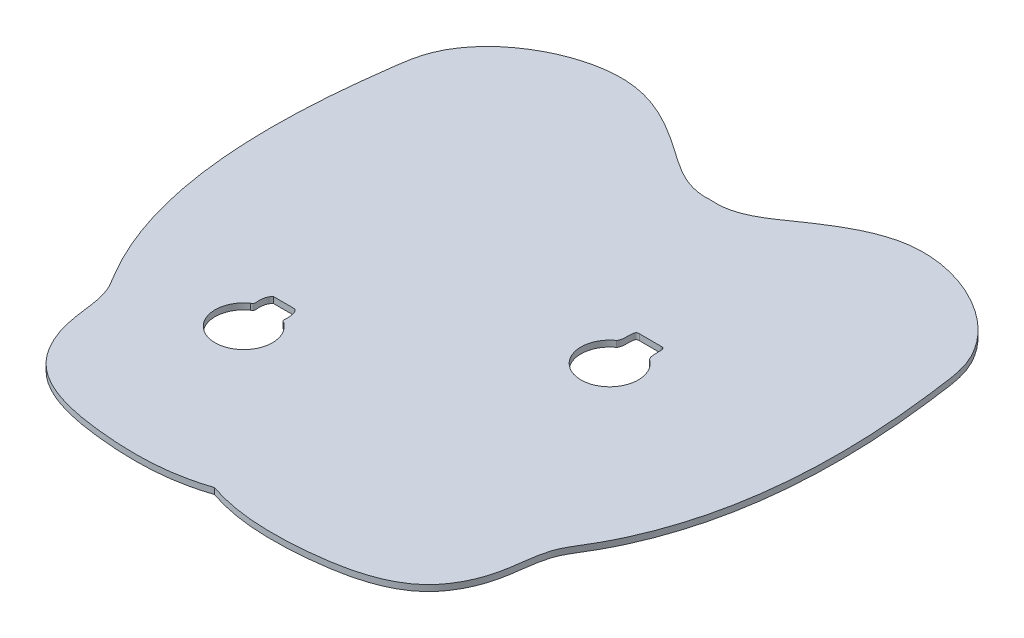
ISO-10303-21;
HEADER;
FILE_DESCRIPTION(('STEP AP214'),'2;1');
FILE_NAME('part.step','',(''),(''),'','','');
FILE_SCHEMA(('AUTOMOTIVE_DESIGN { 1 0 10303 214 1 1 1 1 }'));
ENDSEC;
DATA;
#1=APPLICATION_CONTEXT('core data for automotive mechanical design processes');
#2=APPLICATION_PROTOCOL_DEFINITION('international standard','automotive_design',2000,#1);
#3=PRODUCT_CONTEXT('',#1,'mechanical');
#4=PRODUCT('Part','Part','',(#3));
#5=PRODUCT_RELATED_PRODUCT_CATEGORY('part','',(#4));
#6=PRODUCT_DEFINITION_FORMATION('','',#4);
#7=PRODUCT_DEFINITION_CONTEXT('part definition',#1,'design');
#8=PRODUCT_DEFINITION('design','',#6,#7);
#9=PRODUCT_DEFINITION_SHAPE('','',#8);
#10=(LENGTH_UNIT() NAMED_UNIT(*) SI_UNIT(.MILLI.,.METRE.));
#11=(NAMED_UNIT(*) PLANE_ANGLE_UNIT() SI_UNIT($,.RADIAN.));
#12=(NAMED_UNIT(*) SI_UNIT($,.STERADIAN.) SOLID_ANGLE_UNIT());
#13=UNCERTAINTY_MEASURE_WITH_UNIT(LENGTH_MEASURE(1.E-05),#10,'distance_accuracy_value','');
#14=(GEOMETRIC_REPRESENTATION_CONTEXT(3) GLOBAL_UNCERTAINTY_ASSIGNED_CONTEXT((#13)) GLOBAL_UNIT_ASSIGNED_CONTEXT((#10,
#11,#12)) REPRESENTATION_CONTEXT('',''));
#15=CARTESIAN_POINT('',(0.,0.,0.));
#16=DIRECTION('',(0.,0.,1.));
#17=DIRECTION('',(1.,0.,0.));
#18=AXIS2_PLACEMENT_3D('',#15,#16,#17);
#19=CARTESIAN_POINT('',(-20.8375800086224,2.54,102.170002649145));
#20=DIRECTION('',(0.,1.,0.));
#21=DIRECTION('',(0.,0.,1.));
#22=AXIS2_PLACEMENT_3D('',#19,#20,#21);
#23=PLANE('',#22);
#24=CARTESIAN_POINT('',(97.1721351241759,2.54,18.4153912724598));
#25=CARTESIAN_POINT('',(86.9381358847611,2.54,19.2869067275485));
#26=CARTESIAN_POINT('',(69.4619432479532,2.54,6.07035229588758));
#27=CARTESIAN_POINT('',(31.9557121332239,2.54,-17.2698050691913));
#28=CARTESIAN_POINT('',(-14.2382537415554,2.54,8.22535922004084));
#29=CARTESIAN_POINT('',(-18.010342377572,2.54,36.8793977022031));
#30=CARTESIAN_POINT('',(-24.208672036037,2.54,85.5185639436605));
#31=CARTESIAN_POINT('',(-22.2420602699873,2.54,137.434896367088));
#32=CARTESIAN_POINT('',(5.397241741159,2.54,180.268479021682));
#33=CARTESIAN_POINT('',(5.18009338432536,2.54,197.344803998025));
#34=CARTESIAN_POINT('',(17.409892045632,2.54,224.155676750959));
#35=CARTESIAN_POINT('',(55.745285735242,2.54,232.253076746622));
#36=CARTESIAN_POINT('',(83.3591606785834,2.54,231.368122156612));
#37=CARTESIAN_POINT('',(97.172135124176,2.54,226.672036014327));
#38=B_SPLINE_CURVE_WITH_KNOTS('',3,(#24,#25,#26,#27,#28,#29,#30,#31,#32,#33,#34,#35,#36,#37),
.UNSPECIFIED.,.F.,.F.,(4,1,1,1,1,1,1,1,1,1,1,4),(0.,0.0687687026944584,0.1602583903557,
0.311610255857059,0.34503435388355,0.37053540951732,0.674249376379556,0.690214481787574,
0.741590817935685,0.795466328784328,0.892793029162693,1.),.UNSPECIFIED.);
#39=CARTESIAN_POINT('',(97.1721351241759,2.54,18.4153912724598));
#40=VERTEX_POINT('',#39);
#41=CARTESIAN_POINT('',(97.1721351241759,2.54,226.672036014327));
#42=VERTEX_POINT('',#41);
#43=EDGE_CURVE('E215',#40,#42,#38,.T.);
#44=ORIENTED_EDGE('',*,*,#43,.T.);
#45=CARTESIAN_POINT('',(97.1721351241759,2.54,226.672036014327));
#46=CARTESIAN_POINT('',(110.985109569769,2.54,231.368122156611));
#47=CARTESIAN_POINT('',(138.59898451311,2.54,232.253076746622));
#48=CARTESIAN_POINT('',(176.93437820272,2.54,224.155676750959));
#49=CARTESIAN_POINT('',(189.164176864027,2.54,197.344803998025));
#50=CARTESIAN_POINT('',(188.947028507193,2.54,180.268479021682));
#51=CARTESIAN_POINT('',(216.586330518339,2.54,137.434896367088));
#52=CARTESIAN_POINT('',(218.552942284389,2.54,85.5185639436604));
#53=CARTESIAN_POINT('',(212.354612625924,2.54,36.8793977022031));
#54=CARTESIAN_POINT('',(208.582523989907,2.54,8.22535922004083));
#55=CARTESIAN_POINT('',(162.388558115128,2.54,-17.2698050691913));
#56=CARTESIAN_POINT('',(124.882327000399,2.54,6.07035229588758));
#57=CARTESIAN_POINT('',(107.406134363591,2.54,19.2869067275485));
#58=CARTESIAN_POINT('',(97.1721351241759,2.54,18.4153912724598));
#59=B_SPLINE_CURVE_WITH_KNOTS('',3,(#45,#46,#47,#48,#49,#50,#51,#52,#53,#54,#55,#56,#57,#58),
.UNSPECIFIED.,.F.,.F.,(4,1,1,1,1,1,1,1,1,1,1,4),(0.,0.107206970837307,0.204533671215672,
0.258409182064315,0.309785518212426,0.325750623620444,0.62946459048268,0.65496564611645,
0.688389744142941,0.8397416096443,0.931231297305542,1.),.UNSPECIFIED.);
#60=EDGE_CURVE('E221',#42,#40,#59,.T.);
#61=ORIENTED_EDGE('',*,*,#60,.T.);
#62=EDGE_LOOP('',(#44,#61));
#63=FACE_BOUND('',#62,.T.);
#64=CARTESIAN_POINT('',(44.8677574796913,2.54,162.018397049279));
#65=DIRECTION('',(0.,1.,0.));
#66=DIRECTION('',(0.,0.,1.));
#67=AXIS2_PLACEMENT_3D('',#64,#65,#66);
#68=CIRCLE('',#67,11.9999999999999);
#69=CARTESIAN_POINT('',(37.8824598710261,2.54,152.261060459903));
#70=VERTEX_POINT('',#69);
#71=CARTESIAN_POINT('',(51.8530550883565,2.54,152.261060459903));
#72=VERTEX_POINT('',#71);
#73=EDGE_CURVE('E176',#70,#72,#68,.T.);
#74=ORIENTED_EDGE('',*,*,#73,.F.);
#75=CARTESIAN_POINT('',(40.3401142737763,2.54,145.018397049279));
#76=CARTESIAN_POINT('',(39.3814406831947,2.54,145.772707702371));
#77=CARTESIAN_POINT('',(38.7671652824351,2.54,147.6979702965));
#78=CARTESIAN_POINT('',(38.6502501914807,2.54,150.268136991017));
#79=CARTESIAN_POINT('',(39.0151163970304,2.54,152.139704427047));
#80=CARTESIAN_POINT('',(37.8824598710261,2.54,152.261060459903));
#81=B_SPLINE_CURVE_WITH_KNOTS('',3,(#75,#76,#77,#78,#79,#80),.UNSPECIFIED.,.F.,.F.,(4,1,1,4),
(0.,0.42459825654506,0.700852789682517,1.),.UNSPECIFIED.);
#82=CARTESIAN_POINT('',(40.3401142737763,2.54,145.018397049279));
#83=VERTEX_POINT('',#82);
#84=EDGE_CURVE('E204',#83,#70,#81,.T.);
#85=ORIENTED_EDGE('',*,*,#84,.F.);
#86=DIRECTION('',(-1.,0.,0.));
#87=VECTOR('',#86,1.);
#88=CARTESIAN_POINT('',(49.3954006856062,2.54,145.018397049279));
#89=LINE('',#88,#87);
#90=CARTESIAN_POINT('',(49.3954006856062,2.54,145.018397049279));
#91=VERTEX_POINT('',#90);
#92=EDGE_CURVE('E175',#91,#83,#89,.T.);
#93=ORIENTED_EDGE('',*,*,#92,.F.);
#94=CARTESIAN_POINT('',(51.8530550883565,2.54,152.261060459903));
#95=CARTESIAN_POINT('',(50.7203985623522,2.54,152.139704427047));
#96=CARTESIAN_POINT('',(51.0852647679019,2.54,150.268136991017));
#97=CARTESIAN_POINT('',(50.9683496769475,2.54,147.6979702965));
#98=CARTESIAN_POINT('',(50.3540742761878,2.54,145.772707702371));
#99=CARTESIAN_POINT('',(49.3954006856062,2.54,145.018397049279));
#100=B_SPLINE_CURVE_WITH_KNOTS('',3,(#94,#95,#96,#97,#98,#99),.UNSPECIFIED.,.F.,.F.,(4,1,1,4),
(0.,0.299147210317482,0.575401743454939,1.),.UNSPECIFIED.);
#101=EDGE_CURVE('E168',#72,#91,#100,.T.);
#102=ORIENTED_EDGE('',*,*,#101,.F.);
#103=EDGE_LOOP('',(#74,#85,#93,#102));
#104=FACE_BOUND('',#103,.T.);
#105=CARTESIAN_POINT('',(134.999228380033,2.54,98.8681613024392));
#106=DIRECTION('',(0.,1.,0.));
#107=DIRECTION('',(0.,0.,1.));
#108=AXIS2_PLACEMENT_3D('',#105,#106,#107);
#109=CIRCLE('',#108,11.9999999999999);
#110=CARTESIAN_POINT('',(128.013930771368,2.54,89.1108247130634));
#111=VERTEX_POINT('',#110);
#112=CARTESIAN_POINT('',(141.984525988698,2.54,89.1108247130634));
#113=VERTEX_POINT('',#112);
#114=EDGE_CURVE('E119',#111,#113,#109,.T.);
#115=ORIENTED_EDGE('',*,*,#114,.F.);
#116=CARTESIAN_POINT('',(130.471585174118,2.54,81.8681613024392));
#117=CARTESIAN_POINT('',(129.192079186311,2.54,81.7060575223993));
#118=CARTESIAN_POINT('',(128.906248150761,2.54,83.5117356710188));
#119=CARTESIAN_POINT('',(128.877525774979,2.54,86.1686643913991));
#120=CARTESIAN_POINT('',(128.871790734044,2.54,88.1620080617034));
#121=CARTESIAN_POINT('',(128.013930771368,2.54,89.1108247130634));
#122=B_SPLINE_CURVE_WITH_KNOTS('',3,(#116,#117,#118,#119,#120,#121),.UNSPECIFIED.,.F.,.F.,(4,1,
1,4),(0.,0.308328890007901,0.579015788955856,1.),.UNSPECIFIED.);
#123=CARTESIAN_POINT('',(130.471585174118,2.54,81.8681613024392));
#124=VERTEX_POINT('',#123);
#125=EDGE_CURVE('E111',#124,#111,#122,.T.);
#126=ORIENTED_EDGE('',*,*,#125,.F.);
#127=DIRECTION('',(-1.,0.,0.));
#128=VECTOR('',#127,1.);
#129=CARTESIAN_POINT('',(139.526871585948,2.54,81.8681613024392));
#130=LINE('',#129,#128);
#131=CARTESIAN_POINT('',(139.526871585948,2.54,81.8681613024392));
#132=VERTEX_POINT('',#131);
#133=EDGE_CURVE('E133',#132,#124,#130,.T.);
#134=ORIENTED_EDGE('',*,*,#133,.F.);
#135=CARTESIAN_POINT('',(141.984525988698,2.54,89.1108247130634));
#136=CARTESIAN_POINT('',(141.126666026022,2.54,88.1620080617035));
#137=CARTESIAN_POINT('',(141.120930985087,2.54,86.1686643913991));
#138=CARTESIAN_POINT('',(141.092208609305,2.54,83.5117356710188));
#139=CARTESIAN_POINT('',(140.806377573755,2.54,81.7060575223993));
#140=CARTESIAN_POINT('',(139.526871585948,2.54,81.8681613024392));
#141=B_SPLINE_CURVE_WITH_KNOTS('',3,(#135,#136,#137,#138,#139,#140),.UNSPECIFIED.,.F.,.F.,(4,1,
1,4),(0.,0.420984211044144,0.691671109992099,1.),.UNSPECIFIED.);
#142=EDGE_CURVE('E131',#113,#132,#141,.T.);
#143=ORIENTED_EDGE('',*,*,#142,.F.);
#144=EDGE_LOOP('',(#115,#126,#134,#143));
#145=FACE_BOUND('',#144,.T.);
#146=ADVANCED_FACE('F33',(#63,#104,#145),#23,.T.);
#147=CARTESIAN_POINT('',(-20.8375800086224,0.,102.170002649145));
#148=DIRECTION('',(0.,1.,0.));
#149=DIRECTION('',(0.,0.,1.));
#150=AXIS2_PLACEMENT_3D('',#147,#148,#149);
#151=PLANE('',#150);
#152=CARTESIAN_POINT('',(40.3401142737763,0.,145.018397049279));
#153=CARTESIAN_POINT('',(39.3814406831947,0.,145.772707702371));
#154=CARTESIAN_POINT('',(38.7671652824351,0.,147.6979702965));
#155=CARTESIAN_POINT('',(38.6502501914807,0.,150.268136991017));
#156=CARTESIAN_POINT('',(39.0151163970304,0.,152.139704427047));
#157=CARTESIAN_POINT('',(37.8824598710261,0.,152.261060459903));
#158=B_SPLINE_CURVE_WITH_KNOTS('',3,(#152,#153,#154,#155,#156,#157),.UNSPECIFIED.,.F.,.F.,(4,1,
1,4),(0.,0.42459825654506,0.700852789682517,1.),.UNSPECIFIED.);
#159=CARTESIAN_POINT('',(40.3401142737763,0.,145.018397049279));
#160=VERTEX_POINT('',#159);
#161=CARTESIAN_POINT('',(37.8824598710261,0.,152.261060459903));
#162=VERTEX_POINT('',#161);
#163=EDGE_CURVE('E127',#160,#162,#158,.T.);
#164=ORIENTED_EDGE('',*,*,#163,.T.);
#165=CARTESIAN_POINT('',(44.8677574796913,0.,162.018397049279));
#166=DIRECTION('',(0.,1.,0.));
#167=DIRECTION('',(0.,0.,1.));
#168=AXIS2_PLACEMENT_3D('',#165,#166,#167);
#169=CIRCLE('',#168,11.9999999999999);
#170=CARTESIAN_POINT('',(51.8530550883565,0.,152.261060459903));
#171=VERTEX_POINT('',#170);
#172=EDGE_CURVE('E187',#162,#171,#169,.T.);
#173=ORIENTED_EDGE('',*,*,#172,.T.);
#174=CARTESIAN_POINT('',(51.8530550883565,0.,152.261060459903));
#175=CARTESIAN_POINT('',(50.7203985623522,0.,152.139704427047));
#176=CARTESIAN_POINT('',(51.0852647679019,0.,150.268136991017));
#177=CARTESIAN_POINT('',(50.9683496769475,0.,147.6979702965));
#178=CARTESIAN_POINT('',(50.3540742761878,0.,145.772707702371));
#179=CARTESIAN_POINT('',(49.3954006856062,0.,145.018397049279));
#180=B_SPLINE_CURVE_WITH_KNOTS('',3,(#174,#175,#176,#177,#178,#179),.UNSPECIFIED.,.F.,.F.,(4,1,
1,4),(0.,0.299147210317482,0.575401743454939,1.),.UNSPECIFIED.);
#181=CARTESIAN_POINT('',(49.3954006856062,0.,145.018397049279));
#182=VERTEX_POINT('',#181);
#183=EDGE_CURVE('E193',#171,#182,#180,.T.);
#184=ORIENTED_EDGE('',*,*,#183,.T.);
#185=DIRECTION('',(-1.,0.,0.));
#186=VECTOR('',#185,1.);
#187=CARTESIAN_POINT('',(40.3401142737763,0.,145.018397049279));
#188=LINE('',#187,#186);
#189=EDGE_CURVE('E198',#182,#160,#188,.T.);
#190=ORIENTED_EDGE('',*,*,#189,.T.);
#191=EDGE_LOOP('',(#164,#173,#184,#190));
#192=FACE_BOUND('',#191,.T.);
#193=CARTESIAN_POINT('',(97.1721351241759,0.,18.4153912724598));
#194=CARTESIAN_POINT('',(86.9381358847611,0.,19.2869067275485));
#195=CARTESIAN_POINT('',(69.4619432479532,0.,6.07035229588758));
#196=CARTESIAN_POINT('',(31.9557121332239,0.,-17.2698050691913));
#197=CARTESIAN_POINT('',(-14.2382537415554,0.,8.22535922004084));
#198=CARTESIAN_POINT('',(-18.010342377572,0.,36.8793977022031));
#199=CARTESIAN_POINT('',(-24.208672036037,0.,85.5185639436605));
#200=CARTESIAN_POINT('',(-22.2420602699873,0.,137.434896367088));
#201=CARTESIAN_POINT('',(5.397241741159,0.,180.268479021682));
#202=CARTESIAN_POINT('',(5.18009338432536,0.,197.344803998025));
#203=CARTESIAN_POINT('',(17.409892045632,0.,224.155676750959));
#204=CARTESIAN_POINT('',(55.745285735242,0.,232.253076746622));
#205=CARTESIAN_POINT('',(83.3591606785834,0.,231.368122156612));
#206=CARTESIAN_POINT('',(97.172135124176,0.,226.672036014327));
#207=B_SPLINE_CURVE_WITH_KNOTS('',3,(#193,#194,#195,#196,#197,#198,#199,#200,#201,#202,#203,
#204,#205,#206),.UNSPECIFIED.,.F.,.F.,(4,1,1,1,1,1,1,1,1,1,1,4),(0.,0.0687687026944584,
0.1602583903557,0.311610255857059,0.34503435388355,0.37053540951732,0.674249376379556,
0.690214481787574,0.741590817935685,0.795466328784328,0.892793029162693,1.),.UNSPECIFIED.);
#208=CARTESIAN_POINT('',(97.1721351241759,0.,18.4153912724598));
#209=VERTEX_POINT('',#208);
#210=CARTESIAN_POINT('',(97.1721351241759,0.,226.672036014327));
#211=VERTEX_POINT('',#210);
#212=EDGE_CURVE('E214',#209,#211,#207,.T.);
#213=ORIENTED_EDGE('',*,*,#212,.F.);
#214=CARTESIAN_POINT('',(97.1721351241759,0.,226.672036014327));
#215=CARTESIAN_POINT('',(110.985109569769,0.,231.368122156611));
#216=CARTESIAN_POINT('',(138.59898451311,0.,232.253076746622));
#217=CARTESIAN_POINT('',(176.93437820272,0.,224.155676750959));
#218=CARTESIAN_POINT('',(189.164176864027,0.,197.344803998025));
#219=CARTESIAN_POINT('',(188.947028507193,0.,180.268479021682));
#220=CARTESIAN_POINT('',(216.586330518339,0.,137.434896367088));
#221=CARTESIAN_POINT('',(218.552942284389,0.,85.5185639436604));
#222=CARTESIAN_POINT('',(212.354612625924,0.,36.8793977022031));
#223=CARTESIAN_POINT('',(208.582523989907,0.,8.22535922004083));
#224=CARTESIAN_POINT('',(162.388558115128,0.,-17.2698050691913));
#225=CARTESIAN_POINT('',(124.882327000399,0.,6.07035229588758));
#226=CARTESIAN_POINT('',(107.406134363591,0.,19.2869067275485));
#227=CARTESIAN_POINT('',(97.1721351241759,0.,18.4153912724598));
#228=B_SPLINE_CURVE_WITH_KNOTS('',3,(#214,#215,#216,#217,#218,#219,#220,#221,#222,#223,#224,
#225,#226,#227),.UNSPECIFIED.,.F.,.F.,(4,1,1,1,1,1,1,1,1,1,1,4),(0.,0.107206970837307,
0.204533671215672,0.258409182064315,0.309785518212426,0.325750623620444,0.62946459048268,
0.65496564611645,0.688389744142941,0.8397416096443,0.931231297305542,1.),.UNSPECIFIED.);
#229=EDGE_CURVE('E222',#211,#209,#228,.T.);
#230=ORIENTED_EDGE('',*,*,#229,.F.);
#231=EDGE_LOOP('',(#213,#230));
#232=FACE_BOUND('',#231,.T.);
#233=CARTESIAN_POINT('',(130.471585174118,0.,81.8681613024392));
#234=CARTESIAN_POINT('',(129.192079186311,0.,81.7060575223993));
#235=CARTESIAN_POINT('',(128.906248150761,0.,83.5117356710188));
#236=CARTESIAN_POINT('',(128.877525774979,0.,86.1686643913991));
#237=CARTESIAN_POINT('',(128.871790734044,0.,88.1620080617034));
#238=CARTESIAN_POINT('',(128.013930771368,0.,89.1108247130634));
#239=B_SPLINE_CURVE_WITH_KNOTS('',3,(#233,#234,#235,#236,#237,#238),.UNSPECIFIED.,.F.,.F.,(4,1,
1,4),(0.,0.308328890007901,0.579015788955856,1.),.UNSPECIFIED.);
#240=CARTESIAN_POINT('',(130.471585174118,0.,81.8681613024392));
#241=VERTEX_POINT('',#240);
#242=CARTESIAN_POINT('',(128.013930771368,0.,89.1108247130634));
#243=VERTEX_POINT('',#242);
#244=EDGE_CURVE('E57',#241,#243,#239,.T.);
#245=ORIENTED_EDGE('',*,*,#244,.T.);
#246=CARTESIAN_POINT('',(134.999228380033,0.,98.8681613024392));
#247=DIRECTION('',(0.,1.,0.));
#248=DIRECTION('',(0.,0.,1.));
#249=AXIS2_PLACEMENT_3D('',#246,#247,#248);
#250=CIRCLE('',#249,11.9999999999999);
#251=CARTESIAN_POINT('',(141.984525988698,0.,89.1108247130634));
#252=VERTEX_POINT('',#251);
#253=EDGE_CURVE('E126',#243,#252,#250,.T.);
#254=ORIENTED_EDGE('',*,*,#253,.T.);
#255=CARTESIAN_POINT('',(141.984525988698,0.,89.1108247130634));
#256=CARTESIAN_POINT('',(141.126666026022,0.,88.1620080617035));
#257=CARTESIAN_POINT('',(141.120930985087,0.,86.1686643913991));
#258=CARTESIAN_POINT('',(141.092208609305,0.,83.5117356710188));
#259=CARTESIAN_POINT('',(140.806377573755,0.,81.7060575223993));
#260=CARTESIAN_POINT('',(139.526871585948,0.,81.8681613024392));
#261=B_SPLINE_CURVE_WITH_KNOTS('',3,(#255,#256,#257,#258,#259,#260),.UNSPECIFIED.,.F.,.F.,(4,1,
1,4),(0.,0.420984211044144,0.691671109992099,1.),.UNSPECIFIED.);
#262=CARTESIAN_POINT('',(139.526871585948,0.,81.8681613024392));
#263=VERTEX_POINT('',#262);
#264=EDGE_CURVE('E261',#252,#263,#261,.T.);
#265=ORIENTED_EDGE('',*,*,#264,.T.);
#266=DIRECTION('',(-1.,0.,0.));
#267=VECTOR('',#266,1.);
#268=CARTESIAN_POINT('',(130.471585174118,0.,81.8681613024392));
#269=LINE('',#268,#267);
#270=EDGE_CURVE('E120',#263,#241,#269,.T.);
#271=ORIENTED_EDGE('',*,*,#270,.T.);
#272=EDGE_LOOP('',(#245,#254,#265,#271));
#273=FACE_BOUND('',#272,.T.);
#274=ADVANCED_FACE('F241',(#192,#232,#273),#151,.F.);
#275=DIRECTION('',(0.,-1.,0.));
#276=VECTOR('',#275,1.);
#277=SURFACE_OF_LINEAR_EXTRUSION('',#38,#276);
#278=ORIENTED_EDGE('',*,*,#212,.T.);
#279=DIRECTION('',(0.,-1.,0.));
#280=VECTOR('',#279,1.);
#281=CARTESIAN_POINT('',(97.1721351241759,2.54,226.672036014327));
#282=LINE('',#281,#280);
#283=EDGE_CURVE('E11',#42,#211,#282,.T.);
#284=ORIENTED_EDGE('',*,*,#283,.F.);
#285=ORIENTED_EDGE('',*,*,#43,.F.);
#286=DIRECTION('',(0.,-1.,0.));
#287=VECTOR('',#286,1.);
#288=CARTESIAN_POINT('',(97.1721351241759,2.54,18.4153912724598));
#289=LINE('',#288,#287);
#290=EDGE_CURVE('E42',#40,#209,#289,.T.);
#291=ORIENTED_EDGE('',*,*,#290,.T.);
#292=EDGE_LOOP('',(#278,#284,#285,#291));
#293=FACE_BOUND('',#292,.T.);
#294=ADVANCED_FACE('F35',(#293),#277,.F.);
#295=DIRECTION('',(0.,-1.,0.));
#296=VECTOR('',#295,1.);
#297=SURFACE_OF_LINEAR_EXTRUSION('',#59,#296);
#298=ORIENTED_EDGE('',*,*,#229,.T.);
#299=ORIENTED_EDGE('',*,*,#290,.F.);
#300=ORIENTED_EDGE('',*,*,#60,.F.);
#301=ORIENTED_EDGE('',*,*,#283,.T.);
#302=EDGE_LOOP('',(#298,#299,#300,#301));
#303=FACE_BOUND('',#302,.T.);
#304=ADVANCED_FACE('F236',(#303),#297,.F.);
#305=DIRECTION('',(0.,-1.,0.));
#306=VECTOR('',#305,1.);
#307=SURFACE_OF_LINEAR_EXTRUSION('',#81,#306);
#308=ORIENTED_EDGE('',*,*,#163,.F.);
#309=DIRECTION('',(0.,-1.,0.));
#310=VECTOR('',#309,1.);
#311=CARTESIAN_POINT('',(40.3401142737763,2.54,145.018397049279));
#312=LINE('',#311,#310);
#313=EDGE_CURVE('E182',#83,#160,#312,.T.);
#314=ORIENTED_EDGE('',*,*,#313,.F.);
#315=ORIENTED_EDGE('',*,*,#84,.T.);
#316=DIRECTION('',(0.,-1.,0.));
#317=VECTOR('',#316,1.);
#318=CARTESIAN_POINT('',(37.8824598710261,2.54,152.261060459903));
#319=LINE('',#318,#317);
#320=EDGE_CURVE('E212',#70,#162,#319,.T.);
#321=ORIENTED_EDGE('',*,*,#320,.T.);
#322=EDGE_LOOP('',(#308,#314,#315,#321));
#323=FACE_BOUND('',#322,.T.);
#324=ADVANCED_FACE('F239',(#323),#307,.T.);
#325=CARTESIAN_POINT('',(44.8677574796913,2.54,162.018397049279));
#326=DIRECTION('',(0.,-1.,0.));
#327=DIRECTION('',(0.,0.,-1.));
#328=AXIS2_PLACEMENT_3D('',#325,#326,#327);
#329=CYLINDRICAL_SURFACE('',#328,11.9999999999999);
#330=ORIENTED_EDGE('',*,*,#172,.F.);
#331=ORIENTED_EDGE('',*,*,#320,.F.);
#332=ORIENTED_EDGE('',*,*,#73,.T.);
#333=DIRECTION('',(0.,-1.,0.));
#334=VECTOR('',#333,1.);
#335=CARTESIAN_POINT('',(51.8530550883565,2.54,152.261060459903));
#336=LINE('',#335,#334);
#337=EDGE_CURVE('E210',#72,#171,#336,.T.);
#338=ORIENTED_EDGE('',*,*,#337,.T.);
#339=EDGE_LOOP('',(#330,#331,#332,#338));
#340=FACE_BOUND('',#339,.T.);
#341=ADVANCED_FACE('F165',(#340),#329,.F.);
#342=DIRECTION('',(0.,-1.,0.));
#343=VECTOR('',#342,1.);
#344=SURFACE_OF_LINEAR_EXTRUSION('',#100,#343);
#345=ORIENTED_EDGE('',*,*,#183,.F.);
#346=ORIENTED_EDGE('',*,*,#337,.F.);
#347=ORIENTED_EDGE('',*,*,#101,.T.);
#348=DIRECTION('',(0.,-1.,0.));
#349=VECTOR('',#348,1.);
#350=CARTESIAN_POINT('',(49.3954006856062,2.54,145.018397049279));
#351=LINE('',#350,#349);
#352=EDGE_CURVE('E207',#91,#182,#351,.T.);
#353=ORIENTED_EDGE('',*,*,#352,.T.);
#354=EDGE_LOOP('',(#345,#346,#347,#353));
#355=FACE_BOUND('',#354,.T.);
#356=ADVANCED_FACE('F160',(#355),#344,.T.);
#357=CARTESIAN_POINT('',(40.3401142737763,2.54,145.018397049279));
#358=DIRECTION('',(0.,0.,1.));
#359=DIRECTION('',(1.,0.,0.));
#360=AXIS2_PLACEMENT_3D('',#357,#358,#359);
#361=PLANE('',#360);
#362=ORIENTED_EDGE('',*,*,#189,.F.);
#363=ORIENTED_EDGE('',*,*,#352,.F.);
#364=ORIENTED_EDGE('',*,*,#92,.T.);
#365=ORIENTED_EDGE('',*,*,#313,.T.);
#366=EDGE_LOOP('',(#362,#363,#364,#365));
#367=FACE_BOUND('',#366,.T.);
#368=ADVANCED_FACE('F157',(#367),#361,.T.);
#369=DIRECTION('',(0.,-1.,0.));
#370=VECTOR('',#369,1.);
#371=SURFACE_OF_LINEAR_EXTRUSION('',#122,#370);
#372=ORIENTED_EDGE('',*,*,#244,.F.);
#373=DIRECTION('',(0.,-1.,0.));
#374=VECTOR('',#373,1.);
#375=CARTESIAN_POINT('',(130.471585174118,2.54,81.8681613024392));
#376=LINE('',#375,#374);
#377=EDGE_CURVE('E115',#124,#241,#376,.T.);
#378=ORIENTED_EDGE('',*,*,#377,.F.);
#379=ORIENTED_EDGE('',*,*,#125,.T.);
#380=DIRECTION('',(0.,-1.,0.));
#381=VECTOR('',#380,1.);
#382=CARTESIAN_POINT('',(128.013930771368,2.54,89.1108247130634));
#383=LINE('',#382,#381);
#384=EDGE_CURVE('E114',#111,#243,#383,.T.);
#385=ORIENTED_EDGE('',*,*,#384,.T.);
#386=EDGE_LOOP('',(#372,#378,#379,#385));
#387=FACE_BOUND('',#386,.T.);
#388=ADVANCED_FACE('F113',(#387),#371,.T.);
#389=CARTESIAN_POINT('',(134.999228380033,2.54,98.8681613024392));
#390=DIRECTION('',(0.,-1.,0.));
#391=DIRECTION('',(0.,0.,-1.));
#392=AXIS2_PLACEMENT_3D('',#389,#390,#391);
#393=CYLINDRICAL_SURFACE('',#392,11.9999999999999);
#394=ORIENTED_EDGE('',*,*,#253,.F.);
#395=ORIENTED_EDGE('',*,*,#384,.F.);
#396=ORIENTED_EDGE('',*,*,#114,.T.);
#397=DIRECTION('',(0.,-1.,0.));
#398=VECTOR('',#397,1.);
#399=CARTESIAN_POINT('',(141.984525988698,2.54,89.1108247130634));
#400=LINE('',#399,#398);
#401=EDGE_CURVE('E128',#113,#252,#400,.T.);
#402=ORIENTED_EDGE('',*,*,#401,.T.);
#403=EDGE_LOOP('',(#394,#395,#396,#402));
#404=FACE_BOUND('',#403,.T.);
#405=ADVANCED_FACE('F123',(#404),#393,.F.);
#406=DIRECTION('',(0.,-1.,0.));
#407=VECTOR('',#406,1.);
#408=SURFACE_OF_LINEAR_EXTRUSION('',#141,#407);
#409=ORIENTED_EDGE('',*,*,#264,.F.);
#410=ORIENTED_EDGE('',*,*,#401,.F.);
#411=ORIENTED_EDGE('',*,*,#142,.T.);
#412=DIRECTION('',(0.,-1.,0.));
#413=VECTOR('',#412,1.);
#414=CARTESIAN_POINT('',(139.526871585948,2.54,81.8681613024392));
#415=LINE('',#414,#413);
#416=EDGE_CURVE('E49',#132,#263,#415,.T.);
#417=ORIENTED_EDGE('',*,*,#416,.T.);
#418=EDGE_LOOP('',(#409,#410,#411,#417));
#419=FACE_BOUND('',#418,.T.);
#420=ADVANCED_FACE('F147',(#419),#408,.T.);
#421=CARTESIAN_POINT('',(130.471585174118,2.54,81.8681613024392));
#422=DIRECTION('',(0.,0.,1.));
#423=DIRECTION('',(1.,0.,0.));
#424=AXIS2_PLACEMENT_3D('',#421,#422,#423);
#425=PLANE('',#424);
#426=ORIENTED_EDGE('',*,*,#270,.F.);
#427=ORIENTED_EDGE('',*,*,#416,.F.);
#428=ORIENTED_EDGE('',*,*,#133,.T.);
#429=ORIENTED_EDGE('',*,*,#377,.T.);
#430=EDGE_LOOP('',(#426,#427,#428,#429));
#431=FACE_BOUND('',#430,.T.);
#432=ADVANCED_FACE('F151',(#431),#425,.T.);
#433=CLOSED_SHELL('',(#146,#274,#294,#304,#324,#341,#356,#368,#388,#405,#420,#432));
#434=MANIFOLD_SOLID_BREP('B2',#433);
#435=ADVANCED_BREP_SHAPE_REPRESENTATION('',(#18,#434),#14);
#436=SHAPE_DEFINITION_REPRESENTATION(#9,#435);
ENDSEC;
END-ISO-10303-21;
